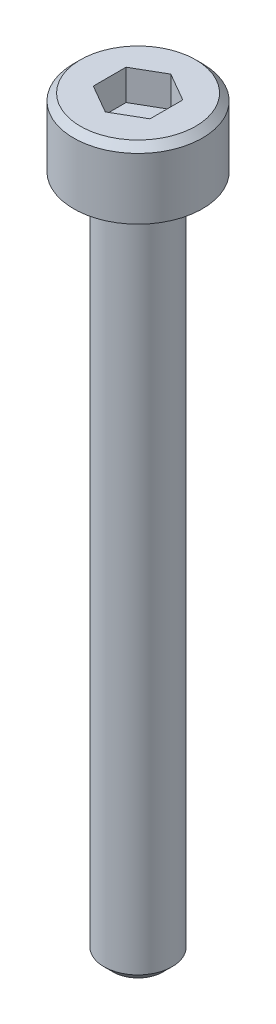
ISO-10303-21;
HEADER;
FILE_DESCRIPTION(('STEP AP214'),'2;1');
FILE_NAME('part.step','',(''),(''),'','','');
FILE_SCHEMA(('AUTOMOTIVE_DESIGN { 1 0 10303 214 1 1 1 1 }'));
ENDSEC;
DATA;
#1=APPLICATION_CONTEXT('core data for automotive mechanical design processes');
#2=APPLICATION_PROTOCOL_DEFINITION('international standard','automotive_design',2000,#1);
#3=PRODUCT_CONTEXT('',#1,'mechanical');
#4=PRODUCT('Part','Part','',(#3));
#5=PRODUCT_RELATED_PRODUCT_CATEGORY('part','',(#4));
#6=PRODUCT_DEFINITION_FORMATION('','',#4);
#7=PRODUCT_DEFINITION_CONTEXT('part definition',#1,'design');
#8=PRODUCT_DEFINITION('design','',#6,#7);
#9=PRODUCT_DEFINITION_SHAPE('','',#8);
#10=(LENGTH_UNIT() NAMED_UNIT(*) SI_UNIT(.MILLI.,.METRE.));
#11=(NAMED_UNIT(*) PLANE_ANGLE_UNIT() SI_UNIT($,.RADIAN.));
#12=(NAMED_UNIT(*) SI_UNIT($,.STERADIAN.) SOLID_ANGLE_UNIT());
#13=UNCERTAINTY_MEASURE_WITH_UNIT(LENGTH_MEASURE(1.E-05),#10,'distance_accuracy_value','');
#14=(GEOMETRIC_REPRESENTATION_CONTEXT(3) GLOBAL_UNCERTAINTY_ASSIGNED_CONTEXT((#13)) GLOBAL_UNIT_ASSIGNED_CONTEXT((#10,
#11,#12)) REPRESENTATION_CONTEXT('',''));
#15=CARTESIAN_POINT('',(0.,0.,0.));
#16=DIRECTION('',(0.,0.,1.));
#17=DIRECTION('',(1.,0.,0.));
#18=AXIS2_PLACEMENT_3D('',#15,#16,#17);
#19=CARTESIAN_POINT('',(0.,-30.,0.));
#20=DIRECTION('',(0.,-1.,0.));
#21=DIRECTION('',(0.,0.,-1.));
#22=AXIS2_PLACEMENT_3D('',#19,#20,#21);
#23=PLANE('',#22);
#24=CARTESIAN_POINT('',(0.,-30.,0.));
#25=DIRECTION('',(0.,-1.,0.));
#26=DIRECTION('',(0.,0.,-1.));
#27=AXIS2_PLACEMENT_3D('',#24,#25,#26);
#28=CIRCLE('',#27,1.1);
#29=CARTESIAN_POINT('',(0.,-30.,-1.1));
#30=VERTEX_POINT('',#29);
#31=EDGE_CURVE('E11',#30,#30,#28,.T.);
#32=ORIENTED_EDGE('',*,*,#31,.T.);
#33=EDGE_LOOP('',(#32));
#34=FACE_BOUND('',#33,.T.);
#35=ADVANCED_FACE('F41',(#34),#23,.T.);
#36=CARTESIAN_POINT('',(0.,-30.,0.));
#37=DIRECTION('',(0.,1.,0.));
#38=DIRECTION('',(0.,0.,1.));
#39=AXIS2_PLACEMENT_3D('',#36,#37,#38);
#40=CONICAL_SURFACE('',#39,1.1,0.785398163397451);
#41=CARTESIAN_POINT('',(0.,-29.6,0.));
#42=DIRECTION('',(0.,-1.,0.));
#43=DIRECTION('',(0.,0.,-1.));
#44=AXIS2_PLACEMENT_3D('',#41,#42,#43);
#45=CIRCLE('',#44,1.5);
#46=CARTESIAN_POINT('',(0.,-29.6,-1.5));
#47=VERTEX_POINT('',#46);
#48=EDGE_CURVE('E48',#47,#47,#45,.T.);
#49=ORIENTED_EDGE('',*,*,#48,.T.);
#50=EDGE_LOOP('',(#49));
#51=FACE_BOUND('',#50,.T.);
#52=ORIENTED_EDGE('',*,*,#31,.F.);
#53=EDGE_LOOP('',(#52));
#54=FACE_BOUND('',#53,.T.);
#55=ADVANCED_FACE('F161',(#51,#54),#40,.T.);
#56=CARTESIAN_POINT('',(0.,-10.,0.));
#57=DIRECTION('',(0.,-1.,0.));
#58=DIRECTION('',(0.,0.,-1.));
#59=AXIS2_PLACEMENT_3D('',#56,#57,#58);
#60=CYLINDRICAL_SURFACE('',#59,1.5);
#61=CARTESIAN_POINT('',(0.,0.,0.));
#62=DIRECTION('',(0.,-1.,0.));
#63=DIRECTION('',(0.,0.,-1.));
#64=AXIS2_PLACEMENT_3D('',#61,#62,#63);
#65=CIRCLE('',#64,1.5);
#66=CARTESIAN_POINT('',(0.,0.,-1.5));
#67=VERTEX_POINT('',#66);
#68=EDGE_CURVE('E156',#67,#67,#65,.T.);
#69=ORIENTED_EDGE('',*,*,#68,.T.);
#70=EDGE_LOOP('',(#69));
#71=FACE_BOUND('',#70,.T.);
#72=ORIENTED_EDGE('',*,*,#48,.F.);
#73=EDGE_LOOP('',(#72));
#74=FACE_BOUND('',#73,.T.);
#75=ADVANCED_FACE('F164',(#71,#74),#60,.T.);
#76=CARTESIAN_POINT('',(1.5,0.,0.));
#77=DIRECTION('',(0.,-1.,0.));
#78=DIRECTION('',(0.,0.,-1.));
#79=AXIS2_PLACEMENT_3D('',#76,#77,#78);
#80=PLANE('',#79);
#81=CARTESIAN_POINT('',(0.,0.,0.));
#82=DIRECTION('',(0.,-1.,0.));
#83=DIRECTION('',(0.,0.,-1.));
#84=AXIS2_PLACEMENT_3D('',#81,#82,#83);
#85=CIRCLE('',#84,2.84);
#86=CARTESIAN_POINT('',(0.,0.,-2.84));
#87=VERTEX_POINT('',#86);
#88=EDGE_CURVE('E153',#87,#87,#85,.T.);
#89=ORIENTED_EDGE('',*,*,#88,.T.);
#90=EDGE_LOOP('',(#89));
#91=FACE_BOUND('',#90,.T.);
#92=ORIENTED_EDGE('',*,*,#68,.F.);
#93=EDGE_LOOP('',(#92));
#94=FACE_BOUND('',#93,.T.);
#95=ADVANCED_FACE('F166',(#91,#94),#80,.T.);
#96=CARTESIAN_POINT('',(0.,-10.,0.));
#97=DIRECTION('',(0.,-1.,0.));
#98=DIRECTION('',(0.,0.,-1.));
#99=AXIS2_PLACEMENT_3D('',#96,#97,#98);
#100=CYLINDRICAL_SURFACE('',#99,2.84);
#101=CARTESIAN_POINT('',(0.,2.7,0.));
#102=DIRECTION('',(0.,-1.,0.));
#103=DIRECTION('',(0.,0.,-1.));
#104=AXIS2_PLACEMENT_3D('',#101,#102,#103);
#105=CIRCLE('',#104,2.84);
#106=CARTESIAN_POINT('',(0.,2.7,-2.84));
#107=VERTEX_POINT('',#106);
#108=EDGE_CURVE('E150',#107,#107,#105,.T.);
#109=ORIENTED_EDGE('',*,*,#108,.T.);
#110=EDGE_LOOP('',(#109));
#111=FACE_BOUND('',#110,.T.);
#112=ORIENTED_EDGE('',*,*,#88,.F.);
#113=EDGE_LOOP('',(#112));
#114=FACE_BOUND('',#113,.T.);
#115=ADVANCED_FACE('F172',(#111,#114),#100,.T.);
#116=CARTESIAN_POINT('',(0.,2.7,0.));
#117=DIRECTION('',(0.,-1.,0.));
#118=DIRECTION('',(0.,0.,-1.));
#119=AXIS2_PLACEMENT_3D('',#116,#117,#118);
#120=CONICAL_SURFACE('',#119,2.84,0.785398163397445);
#121=CARTESIAN_POINT('',(0.,3.,0.));
#122=DIRECTION('',(0.,-1.,0.));
#123=DIRECTION('',(0.,0.,-1.));
#124=AXIS2_PLACEMENT_3D('',#121,#122,#123);
#125=CIRCLE('',#124,2.54);
#126=CARTESIAN_POINT('',(0.,3.,-2.54));
#127=VERTEX_POINT('',#126);
#128=EDGE_CURVE('E142',#127,#127,#125,.T.);
#129=ORIENTED_EDGE('',*,*,#128,.T.);
#130=EDGE_LOOP('',(#129));
#131=FACE_BOUND('',#130,.T.);
#132=ORIENTED_EDGE('',*,*,#108,.F.);
#133=EDGE_LOOP('',(#132));
#134=FACE_BOUND('',#133,.T.);
#135=ADVANCED_FACE('F207',(#131,#134),#120,.T.);
#136=CARTESIAN_POINT('',(2.54,3.,0.));
#137=DIRECTION('',(0.,1.,0.));
#138=DIRECTION('',(0.,0.,1.));
#139=AXIS2_PLACEMENT_3D('',#136,#137,#138);
#140=PLANE('',#139);
#141=DIRECTION('',(0.,0.,-1.));
#142=VECTOR('',#141,1.);
#143=CARTESIAN_POINT('',(1.25,3.,-0.721687836487032));
#144=LINE('',#143,#142);
#145=CARTESIAN_POINT('',(1.25,3.,0.721687836487032));
#146=VERTEX_POINT('',#145);
#147=CARTESIAN_POINT('',(1.25,3.,-0.721687836487032));
#148=VERTEX_POINT('',#147);
#149=EDGE_CURVE('E55',#146,#148,#144,.T.);
#150=ORIENTED_EDGE('',*,*,#149,.F.);
#151=DIRECTION('',(0.866025403784439,0.,-0.5));
#152=VECTOR('',#151,1.);
#153=CARTESIAN_POINT('',(1.25,3.,0.721687836487032));
#154=LINE('',#153,#152);
#155=CARTESIAN_POINT('',(0.,3.,1.44337567297406));
#156=VERTEX_POINT('',#155);
#157=EDGE_CURVE('E138',#156,#146,#154,.T.);
#158=ORIENTED_EDGE('',*,*,#157,.F.);
#159=DIRECTION('',(0.866025403784439,0.,0.5));
#160=VECTOR('',#159,1.);
#161=CARTESIAN_POINT('',(0.,3.,1.44337567297406));
#162=LINE('',#161,#160);
#163=CARTESIAN_POINT('',(-1.25,3.,0.721687836487033));
#164=VERTEX_POINT('',#163);
#165=EDGE_CURVE('E136',#164,#156,#162,.T.);
#166=ORIENTED_EDGE('',*,*,#165,.F.);
#167=DIRECTION('',(0.,0.,1.));
#168=VECTOR('',#167,1.);
#169=CARTESIAN_POINT('',(-1.25,3.,0.721687836487033));
#170=LINE('',#169,#168);
#171=CARTESIAN_POINT('',(-1.25,3.,-0.721687836487032));
#172=VERTEX_POINT('',#171);
#173=EDGE_CURVE('E103',#172,#164,#170,.T.);
#174=ORIENTED_EDGE('',*,*,#173,.F.);
#175=DIRECTION('',(-0.866025403784438,0.,0.5));
#176=VECTOR('',#175,1.);
#177=CARTESIAN_POINT('',(-1.25,3.,-0.721687836487032));
#178=LINE('',#177,#176);
#179=CARTESIAN_POINT('',(0.,3.,-1.44337567297406));
#180=VERTEX_POINT('',#179);
#181=EDGE_CURVE('E132',#180,#172,#178,.T.);
#182=ORIENTED_EDGE('',*,*,#181,.F.);
#183=DIRECTION('',(-0.866025403784439,0.,-0.5));
#184=VECTOR('',#183,1.);
#185=CARTESIAN_POINT('',(0.,3.,-1.44337567297406));
#186=LINE('',#185,#184);
#187=EDGE_CURVE('E129',#148,#180,#186,.T.);
#188=ORIENTED_EDGE('',*,*,#187,.F.);
#189=EDGE_LOOP('',(#150,#158,#166,#174,#182,#188));
#190=FACE_BOUND('',#189,.T.);
#191=ORIENTED_EDGE('',*,*,#128,.F.);
#192=EDGE_LOOP('',(#191));
#193=FACE_BOUND('',#192,.T.);
#194=ADVANCED_FACE('F216',(#190,#193),#140,.T.);
#195=CARTESIAN_POINT('',(1.25,1.65,-0.721687836487032));
#196=DIRECTION('',(1.,0.,0.));
#197=DIRECTION('',(0.,0.,-1.));
#198=AXIS2_PLACEMENT_3D('',#195,#196,#197);
#199=PLANE('',#198);
#200=ORIENTED_EDGE('',*,*,#149,.T.);
#201=DIRECTION('',(0.,1.,0.));
#202=VECTOR('',#201,1.);
#203=CARTESIAN_POINT('',(1.25,1.65,-0.721687836487032));
#204=LINE('',#203,#202);
#205=CARTESIAN_POINT('',(1.25,1.65,-0.721687836487032));
#206=VERTEX_POINT('',#205);
#207=EDGE_CURVE('E85',#206,#148,#204,.T.);
#208=ORIENTED_EDGE('',*,*,#207,.F.);
#209=DIRECTION('',(0.,0.,-1.));
#210=VECTOR('',#209,1.);
#211=CARTESIAN_POINT('',(1.25,1.65,-0.721687836487032));
#212=LINE('',#211,#210);
#213=CARTESIAN_POINT('',(1.25,1.65,0.721687836487032));
#214=VERTEX_POINT('',#213);
#215=EDGE_CURVE('E140',#214,#206,#212,.T.);
#216=ORIENTED_EDGE('',*,*,#215,.F.);
#217=DIRECTION('',(0.,1.,0.));
#218=VECTOR('',#217,1.);
#219=CARTESIAN_POINT('',(1.25,1.65,0.721687836487032));
#220=LINE('',#219,#218);
#221=EDGE_CURVE('E63',#214,#146,#220,.T.);
#222=ORIENTED_EDGE('',*,*,#221,.T.);
#223=EDGE_LOOP('',(#200,#208,#216,#222));
#224=FACE_BOUND('',#223,.T.);
#225=ADVANCED_FACE('F225',(#224),#199,.F.);
#226=CARTESIAN_POINT('',(1.25,1.65,0.721687836487032));
#227=DIRECTION('',(0.5,0.,0.866025403784439));
#228=DIRECTION('',(0.866025403784439,0.,-0.5));
#229=AXIS2_PLACEMENT_3D('',#226,#227,#228);
#230=PLANE('',#229);
#231=ORIENTED_EDGE('',*,*,#157,.T.);
#232=ORIENTED_EDGE('',*,*,#221,.F.);
#233=DIRECTION('',(0.866025403784439,0.,-0.5));
#234=VECTOR('',#233,1.);
#235=CARTESIAN_POINT('',(1.25,1.65,0.721687836487032));
#236=LINE('',#235,#234);
#237=CARTESIAN_POINT('',(0.,1.65,1.44337567297406));
#238=VERTEX_POINT('',#237);
#239=EDGE_CURVE('E115',#238,#214,#236,.T.);
#240=ORIENTED_EDGE('',*,*,#239,.F.);
#241=DIRECTION('',(0.,1.,0.));
#242=VECTOR('',#241,1.);
#243=CARTESIAN_POINT('',(0.,1.65,1.44337567297406));
#244=LINE('',#243,#242);
#245=EDGE_CURVE('E107',#238,#156,#244,.T.);
#246=ORIENTED_EDGE('',*,*,#245,.T.);
#247=EDGE_LOOP('',(#231,#232,#240,#246));
#248=FACE_BOUND('',#247,.T.);
#249=ADVANCED_FACE('F234',(#248),#230,.F.);
#250=CARTESIAN_POINT('',(0.,1.65,1.44337567297406));
#251=DIRECTION('',(-0.5,0.,0.866025403784439));
#252=DIRECTION('',(0.866025403784439,0.,0.5));
#253=AXIS2_PLACEMENT_3D('',#250,#251,#252);
#254=PLANE('',#253);
#255=ORIENTED_EDGE('',*,*,#165,.T.);
#256=ORIENTED_EDGE('',*,*,#245,.F.);
#257=DIRECTION('',(0.866025403784439,0.,0.5));
#258=VECTOR('',#257,1.);
#259=CARTESIAN_POINT('',(0.,1.65,1.44337567297406));
#260=LINE('',#259,#258);
#261=CARTESIAN_POINT('',(-1.25,1.65,0.721687836487033));
#262=VERTEX_POINT('',#261);
#263=EDGE_CURVE('E111',#262,#238,#260,.T.);
#264=ORIENTED_EDGE('',*,*,#263,.F.);
#265=DIRECTION('',(0.,1.,0.));
#266=VECTOR('',#265,1.);
#267=CARTESIAN_POINT('',(-1.25,1.65,0.721687836487033));
#268=LINE('',#267,#266);
#269=EDGE_CURVE('E96',#262,#164,#268,.T.);
#270=ORIENTED_EDGE('',*,*,#269,.T.);
#271=EDGE_LOOP('',(#255,#256,#264,#270));
#272=FACE_BOUND('',#271,.T.);
#273=ADVANCED_FACE('F112',(#272),#254,.F.);
#274=CARTESIAN_POINT('',(-1.25,1.65,0.721687836487033));
#275=DIRECTION('',(-1.,0.,0.));
#276=DIRECTION('',(0.,0.,1.));
#277=AXIS2_PLACEMENT_3D('',#274,#275,#276);
#278=PLANE('',#277);
#279=ORIENTED_EDGE('',*,*,#173,.T.);
#280=ORIENTED_EDGE('',*,*,#269,.F.);
#281=DIRECTION('',(0.,0.,1.));
#282=VECTOR('',#281,1.);
#283=CARTESIAN_POINT('',(-1.25,1.65,0.721687836487033));
#284=LINE('',#283,#282);
#285=CARTESIAN_POINT('',(-1.25,1.65,-0.721687836487032));
#286=VERTEX_POINT('',#285);
#287=EDGE_CURVE('E100',#286,#262,#284,.T.);
#288=ORIENTED_EDGE('',*,*,#287,.F.);
#289=DIRECTION('',(0.,1.,0.));
#290=VECTOR('',#289,1.);
#291=CARTESIAN_POINT('',(-1.25,1.65,-0.721687836487032));
#292=LINE('',#291,#290);
#293=EDGE_CURVE('E108',#286,#172,#292,.T.);
#294=ORIENTED_EDGE('',*,*,#293,.T.);
#295=EDGE_LOOP('',(#279,#280,#288,#294));
#296=FACE_BOUND('',#295,.T.);
#297=ADVANCED_FACE('F98',(#296),#278,.F.);
#298=CARTESIAN_POINT('',(-1.25,1.65,-0.721687836487032));
#299=DIRECTION('',(-0.5,0.,-0.866025403784438));
#300=DIRECTION('',(-0.866025403784439,0.,0.5));
#301=AXIS2_PLACEMENT_3D('',#298,#299,#300);
#302=PLANE('',#301);
#303=ORIENTED_EDGE('',*,*,#181,.T.);
#304=ORIENTED_EDGE('',*,*,#293,.F.);
#305=DIRECTION('',(-0.866025403784438,0.,0.5));
#306=VECTOR('',#305,1.);
#307=CARTESIAN_POINT('',(-1.25,1.65,-0.721687836487032));
#308=LINE('',#307,#306);
#309=CARTESIAN_POINT('',(0.,1.65,-1.44337567297406));
#310=VERTEX_POINT('',#309);
#311=EDGE_CURVE('E121',#310,#286,#308,.T.);
#312=ORIENTED_EDGE('',*,*,#311,.F.);
#313=DIRECTION('',(0.,1.,0.));
#314=VECTOR('',#313,1.);
#315=CARTESIAN_POINT('',(0.,1.65,-1.44337567297406));
#316=LINE('',#315,#314);
#317=EDGE_CURVE('E145',#310,#180,#316,.T.);
#318=ORIENTED_EDGE('',*,*,#317,.T.);
#319=EDGE_LOOP('',(#303,#304,#312,#318));
#320=FACE_BOUND('',#319,.T.);
#321=ADVANCED_FACE('F256',(#320),#302,.F.);
#322=CARTESIAN_POINT('',(0.,1.65,-1.44337567297406));
#323=DIRECTION('',(0.5,0.,-0.866025403784439));
#324=DIRECTION('',(-0.866025403784439,0.,-0.5));
#325=AXIS2_PLACEMENT_3D('',#322,#323,#324);
#326=PLANE('',#325);
#327=ORIENTED_EDGE('',*,*,#187,.T.);
#328=ORIENTED_EDGE('',*,*,#317,.F.);
#329=DIRECTION('',(-0.866025403784439,0.,-0.5));
#330=VECTOR('',#329,1.);
#331=CARTESIAN_POINT('',(0.,1.65,-1.44337567297406));
#332=LINE('',#331,#330);
#333=EDGE_CURVE('E123',#206,#310,#332,.T.);
#334=ORIENTED_EDGE('',*,*,#333,.F.);
#335=ORIENTED_EDGE('',*,*,#207,.T.);
#336=EDGE_LOOP('',(#327,#328,#334,#335));
#337=FACE_BOUND('',#336,.T.);
#338=ADVANCED_FACE('F264',(#337),#326,.F.);
#339=CARTESIAN_POINT('',(0.,1.65,0.));
#340=DIRECTION('',(0.,-1.,0.));
#341=DIRECTION('',(0.,0.,-1.));
#342=AXIS2_PLACEMENT_3D('',#339,#340,#341);
#343=PLANE('',#342);
#344=ORIENTED_EDGE('',*,*,#215,.T.);
#345=ORIENTED_EDGE('',*,*,#333,.T.);
#346=ORIENTED_EDGE('',*,*,#311,.T.);
#347=ORIENTED_EDGE('',*,*,#287,.T.);
#348=ORIENTED_EDGE('',*,*,#263,.T.);
#349=ORIENTED_EDGE('',*,*,#239,.T.);
#350=EDGE_LOOP('',(#344,#345,#346,#347,#348,#349));
#351=FACE_BOUND('',#350,.T.);
#352=ADVANCED_FACE('F118',(#351),#343,.F.);
#353=CLOSED_SHELL('',(#35,#55,#75,#95,#115,#135,#194,#225,#249,#273,#297,#321,#338,#352));
#354=MANIFOLD_SOLID_BREP('B2',#353);
#355=ADVANCED_BREP_SHAPE_REPRESENTATION('',(#18,#354),#14);
#356=SHAPE_DEFINITION_REPRESENTATION(#9,#355);
ENDSEC;
END-ISO-10303-21;
